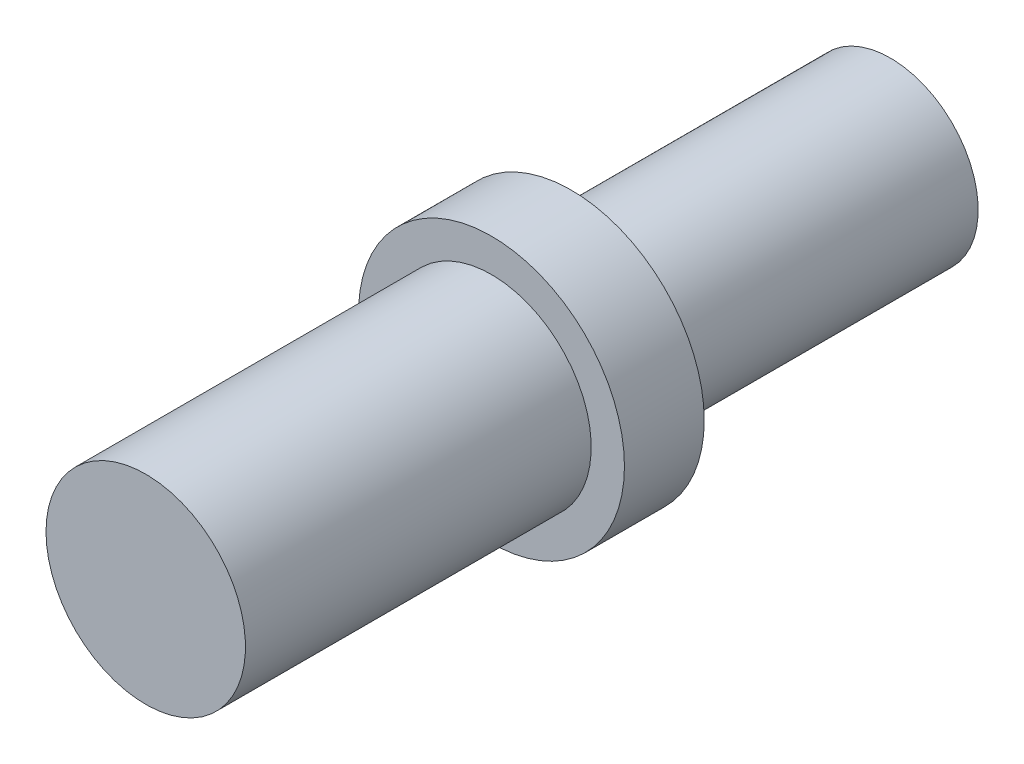
ISO-10303-21;
HEADER;
FILE_DESCRIPTION(('STEP AP214'),'2;1');
FILE_NAME('part.step','',(''),(''),'','','');
FILE_SCHEMA(('AUTOMOTIVE_DESIGN { 1 0 10303 214 1 1 1 1 }'));
ENDSEC;
DATA;
#1=APPLICATION_CONTEXT('core data for automotive mechanical design processes');
#2=APPLICATION_PROTOCOL_DEFINITION('international standard','automotive_design',2000,#1);
#3=PRODUCT_CONTEXT('',#1,'mechanical');
#4=PRODUCT('Part','Part','',(#3));
#5=PRODUCT_RELATED_PRODUCT_CATEGORY('part','',(#4));
#6=PRODUCT_DEFINITION_FORMATION('','',#4);
#7=PRODUCT_DEFINITION_CONTEXT('part definition',#1,'design');
#8=PRODUCT_DEFINITION('design','',#6,#7);
#9=PRODUCT_DEFINITION_SHAPE('','',#8);
#10=(LENGTH_UNIT() NAMED_UNIT(*) SI_UNIT(.MILLI.,.METRE.));
#11=(NAMED_UNIT(*) PLANE_ANGLE_UNIT() SI_UNIT($,.RADIAN.));
#12=(NAMED_UNIT(*) SI_UNIT($,.STERADIAN.) SOLID_ANGLE_UNIT());
#13=UNCERTAINTY_MEASURE_WITH_UNIT(LENGTH_MEASURE(1.E-05),#10,'distance_accuracy_value','');
#14=(GEOMETRIC_REPRESENTATION_CONTEXT(3) GLOBAL_UNCERTAINTY_ASSIGNED_CONTEXT((#13)) GLOBAL_UNIT_ASSIGNED_CONTEXT((#10,
#11,#12)) REPRESENTATION_CONTEXT('',''));
#15=CARTESIAN_POINT('',(0.,0.,0.));
#16=DIRECTION('',(0.,0.,1.));
#17=DIRECTION('',(1.,0.,0.));
#18=AXIS2_PLACEMENT_3D('',#15,#16,#17);
#19=CARTESIAN_POINT('',(-36.5655198451616,-95.3074440446685,3.));
#20=DIRECTION('',(0.,0.,-1.));
#21=DIRECTION('',(-1.,0.,0.));
#22=AXIS2_PLACEMENT_3D('',#19,#20,#21);
#23=CYLINDRICAL_SURFACE('',#22,5.);
#24=CARTESIAN_POINT('',(-36.5655198451616,-95.3074440446685,3.));
#25=DIRECTION('',(0.,0.,1.));
#26=DIRECTION('',(1.,0.,0.));
#27=AXIS2_PLACEMENT_3D('',#24,#25,#26);
#28=CIRCLE('',#27,5.);
#29=CARTESIAN_POINT('',(-31.5655198451616,-95.3074440446685,3.));
#30=VERTEX_POINT('',#29);
#31=EDGE_CURVE('E42',#30,#30,#28,.T.);
#32=ORIENTED_EDGE('',*,*,#31,.F.);
#33=EDGE_LOOP('',(#32));
#34=FACE_BOUND('',#33,.T.);
#35=CARTESIAN_POINT('',(-36.5655198451616,-95.3074440446685,0.));
#36=DIRECTION('',(0.,0.,1.));
#37=DIRECTION('',(1.,0.,0.));
#38=AXIS2_PLACEMENT_3D('',#35,#36,#37);
#39=CIRCLE('',#38,5.);
#40=CARTESIAN_POINT('',(-31.5655198451616,-95.3074440446685,0.));
#41=VERTEX_POINT('',#40);
#42=EDGE_CURVE('E33',#41,#41,#39,.T.);
#43=ORIENTED_EDGE('',*,*,#42,.T.);
#44=EDGE_LOOP('',(#43));
#45=FACE_BOUND('',#44,.T.);
#46=ADVANCED_FACE('F30',(#34,#45),#23,.T.);
#47=CARTESIAN_POINT('',(-36.5655198451616,-95.3074440446685,3.));
#48=DIRECTION('',(0.,0.,1.));
#49=DIRECTION('',(1.,0.,0.));
#50=AXIS2_PLACEMENT_3D('',#47,#48,#49);
#51=PLANE('',#50);
#52=CARTESIAN_POINT('',(-36.5655198451616,-95.3074440446685,3.));
#53=DIRECTION('',(0.,0.,1.));
#54=DIRECTION('',(1.,0.,0.));
#55=AXIS2_PLACEMENT_3D('',#52,#53,#54);
#56=CIRCLE('',#55,3.75);
#57=CARTESIAN_POINT('',(-40.3155198451616,-95.3074440446685,3.));
#58=VERTEX_POINT('',#57);
#59=EDGE_CURVE('E10',#58,#58,#56,.T.);
#60=ORIENTED_EDGE('',*,*,#59,.F.);
#61=EDGE_LOOP('',(#60));
#62=FACE_BOUND('',#61,.T.);
#63=ORIENTED_EDGE('',*,*,#31,.T.);
#64=EDGE_LOOP('',(#63));
#65=FACE_BOUND('',#64,.T.);
#66=ADVANCED_FACE('F59',(#62,#65),#51,.T.);
#67=CARTESIAN_POINT('',(-36.5655198451616,-95.3074440446685,0.));
#68=DIRECTION('',(0.,0.,1.));
#69=DIRECTION('',(1.,0.,0.));
#70=AXIS2_PLACEMENT_3D('',#67,#68,#69);
#71=PLANE('',#70);
#72=CARTESIAN_POINT('',(-36.5655198451616,-95.3074440446685,0.));
#73=DIRECTION('',(0.,0.,-1.));
#74=DIRECTION('',(-1.,0.,0.));
#75=AXIS2_PLACEMENT_3D('',#72,#73,#74);
#76=CIRCLE('',#75,3.3);
#77=CARTESIAN_POINT('',(-39.8655198451616,-95.3074440446685,0.));
#78=VERTEX_POINT('',#77);
#79=EDGE_CURVE('E37',#78,#78,#76,.T.);
#80=ORIENTED_EDGE('',*,*,#79,.F.);
#81=EDGE_LOOP('',(#80));
#82=FACE_BOUND('',#81,.T.);
#83=ORIENTED_EDGE('',*,*,#42,.F.);
#84=EDGE_LOOP('',(#83));
#85=FACE_BOUND('',#84,.T.);
#86=ADVANCED_FACE('F56',(#82,#85),#71,.F.);
#87=CARTESIAN_POINT('',(-36.5655198451616,-95.3074440446685,-12.));
#88=DIRECTION('',(0.,0.,1.));
#89=DIRECTION('',(1.,0.,0.));
#90=AXIS2_PLACEMENT_3D('',#87,#88,#89);
#91=CYLINDRICAL_SURFACE('',#90,3.3);
#92=CARTESIAN_POINT('',(-36.5655198451616,-95.3074440446685,-12.));
#93=DIRECTION('',(0.,0.,-1.));
#94=DIRECTION('',(-1.,0.,0.));
#95=AXIS2_PLACEMENT_3D('',#92,#93,#94);
#96=CIRCLE('',#95,3.3);
#97=CARTESIAN_POINT('',(-39.8655198451616,-95.3074440446685,-12.));
#98=VERTEX_POINT('',#97);
#99=EDGE_CURVE('E47',#98,#98,#96,.T.);
#100=ORIENTED_EDGE('',*,*,#99,.F.);
#101=EDGE_LOOP('',(#100));
#102=FACE_BOUND('',#101,.T.);
#103=ORIENTED_EDGE('',*,*,#79,.T.);
#104=EDGE_LOOP('',(#103));
#105=FACE_BOUND('',#104,.T.);
#106=ADVANCED_FACE('F58',(#102,#105),#91,.T.);
#107=CARTESIAN_POINT('',(-36.5655198451616,-95.3074440446685,-12.));
#108=DIRECTION('',(0.,0.,-1.));
#109=DIRECTION('',(-1.,0.,0.));
#110=AXIS2_PLACEMENT_3D('',#107,#108,#109);
#111=PLANE('',#110);
#112=ORIENTED_EDGE('',*,*,#99,.T.);
#113=EDGE_LOOP('',(#112));
#114=FACE_BOUND('',#113,.T.);
#115=ADVANCED_FACE('F65',(#114),#111,.T.);
#116=CARTESIAN_POINT('',(-36.5655198451616,-95.3074440446685,16.));
#117=DIRECTION('',(0.,0.,-1.));
#118=DIRECTION('',(-1.,0.,0.));
#119=AXIS2_PLACEMENT_3D('',#116,#117,#118);
#120=CYLINDRICAL_SURFACE('',#119,3.75);
#121=CARTESIAN_POINT('',(-36.5655198451616,-95.3074440446685,16.));
#122=DIRECTION('',(0.,0.,1.));
#123=DIRECTION('',(1.,0.,0.));
#124=AXIS2_PLACEMENT_3D('',#121,#122,#123);
#125=CIRCLE('',#124,3.75);
#126=CARTESIAN_POINT('',(-40.3155198451616,-95.3074440446685,16.));
#127=VERTEX_POINT('',#126);
#128=EDGE_CURVE('E46',#127,#127,#125,.T.);
#129=CARTESIAN_POINT('',(-40.3155198451616,-95.3074440446685,16.));
#130=CARTESIAN_POINT('',(-40.3155198451616,-95.3074440446685,15.8645833333333));
#131=CARTESIAN_POINT('',(-40.3155198451616,-95.3074440446685,15.7291666666667));
#132=CARTESIAN_POINT('',(-40.3155198451616,-95.3074440446685,15.4583333333333));
#133=CARTESIAN_POINT('',(-40.3155198451616,-95.3074440446685,15.3229166666667));
#134=CARTESIAN_POINT('',(-40.3155198451616,-95.3074440446685,15.0520833333333));
#135=CARTESIAN_POINT('',(-40.3155198451616,-95.3074440446685,14.9166666666667));
#136=CARTESIAN_POINT('',(-40.3155198451616,-95.3074440446685,14.6458333333333));
#137=CARTESIAN_POINT('',(-40.3155198451616,-95.3074440446685,14.5104166666667));
#138=CARTESIAN_POINT('',(-40.3155198451616,-95.3074440446685,14.2395833333333));
#139=CARTESIAN_POINT('',(-40.3155198451616,-95.3074440446685,14.1041666666667));
#140=CARTESIAN_POINT('',(-40.3155198451616,-95.3074440446685,13.8333333333333));
#141=CARTESIAN_POINT('',(-40.3155198451616,-95.3074440446685,13.6979166666667));
#142=CARTESIAN_POINT('',(-40.3155198451616,-95.3074440446685,13.4270833333333));
#143=CARTESIAN_POINT('',(-40.3155198451616,-95.3074440446685,13.2916666666667));
#144=CARTESIAN_POINT('',(-40.3155198451616,-95.3074440446685,13.0208333333333));
#145=CARTESIAN_POINT('',(-40.3155198451616,-95.3074440446685,12.8854166666667));
#146=CARTESIAN_POINT('',(-40.3155198451616,-95.3074440446685,12.6145833333333));
#147=CARTESIAN_POINT('',(-40.3155198451616,-95.3074440446685,12.4791666666667));
#148=CARTESIAN_POINT('',(-40.3155198451616,-95.3074440446685,12.2083333333333));
#149=CARTESIAN_POINT('',(-40.3155198451616,-95.3074440446685,12.0729166666667));
#150=CARTESIAN_POINT('',(-40.3155198451616,-95.3074440446685,11.8020833333333));
#151=CARTESIAN_POINT('',(-40.3155198451616,-95.3074440446685,11.6666666666667));
#152=CARTESIAN_POINT('',(-40.3155198451616,-95.3074440446685,11.3958333333333));
#153=CARTESIAN_POINT('',(-40.3155198451616,-95.3074440446685,11.2604166666667));
#154=CARTESIAN_POINT('',(-40.3155198451616,-95.3074440446685,10.9895833333333));
#155=CARTESIAN_POINT('',(-40.3155198451616,-95.3074440446685,10.8541666666667));
#156=CARTESIAN_POINT('',(-40.3155198451616,-95.3074440446685,10.5833333333333));
#157=CARTESIAN_POINT('',(-40.3155198451616,-95.3074440446685,10.4479166666667));
#158=CARTESIAN_POINT('',(-40.3155198451616,-95.3074440446685,10.1770833333333));
#159=CARTESIAN_POINT('',(-40.3155198451616,-95.3074440446685,10.0416666666667));
#160=CARTESIAN_POINT('',(-40.3155198451616,-95.3074440446685,9.77083333333333));
#161=CARTESIAN_POINT('',(-40.3155198451616,-95.3074440446685,9.63541666666667));
#162=CARTESIAN_POINT('',(-40.3155198451616,-95.3074440446685,9.36458333333333));
#163=CARTESIAN_POINT('',(-40.3155198451616,-95.3074440446685,9.22916666666667));
#164=CARTESIAN_POINT('',(-40.3155198451616,-95.3074440446685,8.95833333333333));
#165=CARTESIAN_POINT('',(-40.3155198451616,-95.3074440446685,8.82291666666667));
#166=CARTESIAN_POINT('',(-40.3155198451616,-95.3074440446685,8.55208333333333));
#167=CARTESIAN_POINT('',(-40.3155198451616,-95.3074440446685,8.41666666666667));
#168=CARTESIAN_POINT('',(-40.3155198451616,-95.3074440446685,8.14583333333333));
#169=CARTESIAN_POINT('',(-40.3155198451616,-95.3074440446685,8.01041666666667));
#170=CARTESIAN_POINT('',(-40.3155198451616,-95.3074440446685,7.73958333333333));
#171=CARTESIAN_POINT('',(-40.3155198451616,-95.3074440446685,7.60416666666667));
#172=CARTESIAN_POINT('',(-40.3155198451616,-95.3074440446685,7.33333333333333));
#173=CARTESIAN_POINT('',(-40.3155198451616,-95.3074440446685,7.19791666666667));
#174=CARTESIAN_POINT('',(-40.3155198451616,-95.3074440446685,6.92708333333333));
#175=CARTESIAN_POINT('',(-40.3155198451616,-95.3074440446685,6.79166666666667));
#176=CARTESIAN_POINT('',(-40.3155198451616,-95.3074440446685,6.52083333333333));
#177=CARTESIAN_POINT('',(-40.3155198451616,-95.3074440446685,6.38541666666667));
#178=CARTESIAN_POINT('',(-40.3155198451616,-95.3074440446685,6.11458333333333));
#179=CARTESIAN_POINT('',(-40.3155198451616,-95.3074440446685,5.97916666666667));
#180=CARTESIAN_POINT('',(-40.3155198451616,-95.3074440446685,5.70833333333333));
#181=CARTESIAN_POINT('',(-40.3155198451616,-95.3074440446685,5.57291666666667));
#182=CARTESIAN_POINT('',(-40.3155198451616,-95.3074440446685,5.30208333333333));
#183=CARTESIAN_POINT('',(-40.3155198451616,-95.3074440446685,5.16666666666667));
#184=CARTESIAN_POINT('',(-40.3155198451616,-95.3074440446685,4.89583333333333));
#185=CARTESIAN_POINT('',(-40.3155198451616,-95.3074440446685,4.76041666666667));
#186=CARTESIAN_POINT('',(-40.3155198451616,-95.3074440446685,4.48958333333333));
#187=CARTESIAN_POINT('',(-40.3155198451616,-95.3074440446685,4.35416666666667));
#188=CARTESIAN_POINT('',(-40.3155198451616,-95.3074440446685,4.08333333333333));
#189=CARTESIAN_POINT('',(-40.3155198451616,-95.3074440446685,3.94791666666667));
#190=CARTESIAN_POINT('',(-40.3155198451616,-95.3074440446685,3.67708333333333));
#191=CARTESIAN_POINT('',(-40.3155198451616,-95.3074440446685,3.54166666666667));
#192=CARTESIAN_POINT('',(-40.3155198451616,-95.3074440446685,3.27083333333333));
#193=CARTESIAN_POINT('',(-40.3155198451616,-95.3074440446685,3.13541666666667));
#194=CARTESIAN_POINT('',(-40.3155198451616,-95.3074440446685,3.));
#195=B_SPLINE_CURVE_WITH_KNOTS('',3,(#129,#130,#131,#132,#133,#134,#135,#136,#137,#138,#139,
#140,#141,#142,#143,#144,#145,#146,#147,#148,#149,#150,#151,#152,#153,#154,#155,#156,#157,#158,
#159,#160,#161,#162,#163,#164,#165,#166,#167,#168,#169,#170,#171,#172,#173,#174,#175,#176,#177,
#178,#179,#180,#181,#182,#183,#184,#185,#186,#187,#188,#189,#190,#191,#192,#193,#194),
.UNSPECIFIED.,.F.,.F.,(4,2,2,2,2,2,2,2,2,2,2,2,2,2,2,2,2,2,2,2,2,2,2,2,2,2,2,2,2,2,2,2,4),(0.,
0.406250000000002,0.812500000000001,1.21875,1.625,2.03125,2.4375,2.84375,3.25,3.65625,4.0625,
4.46875,4.875,5.28125,5.6875,6.09375,6.5,6.90625,7.3125,7.71875,8.125,8.53125,8.9375,9.34375,
9.75,10.15625,10.5625,10.96875,11.375,11.78125,12.1875,12.59375,13.),.UNSPECIFIED.);
#196=EDGE_CURVE('BSEAM90',#127,#58,#195,.T.);
#197=ORIENTED_EDGE('',*,*,#128,.F.);
#198=ORIENTED_EDGE('',*,*,#59,.T.);
#199=ORIENTED_EDGE('',*,*,#196,.T.);
#200=ORIENTED_EDGE('',*,*,#196,.F.);
#201=EDGE_LOOP('',(#197,#199,#198,#200));
#202=FACE_BOUND('',#201,.T.);
#203=ADVANCED_FACE('F90',(#202),#120,.T.);
#204=CARTESIAN_POINT('',(-36.5655198451616,-95.3074440446685,16.));
#205=DIRECTION('',(0.,0.,1.));
#206=DIRECTION('',(1.,0.,0.));
#207=AXIS2_PLACEMENT_3D('',#204,#205,#206);
#208=PLANE('',#207);
#209=ORIENTED_EDGE('',*,*,#128,.T.);
#210=EDGE_LOOP('',(#209));
#211=FACE_BOUND('',#210,.T.);
#212=ADVANCED_FACE('F95',(#211),#208,.T.);
#213=CLOSED_SHELL('',(#46,#66,#86,#106,#115,#203,#212));
#214=MANIFOLD_SOLID_BREP('B2',#213);
#215=ADVANCED_BREP_SHAPE_REPRESENTATION('',(#18,#214),#14);
#216=SHAPE_DEFINITION_REPRESENTATION(#9,#215);
ENDSEC;
END-ISO-10303-21;
